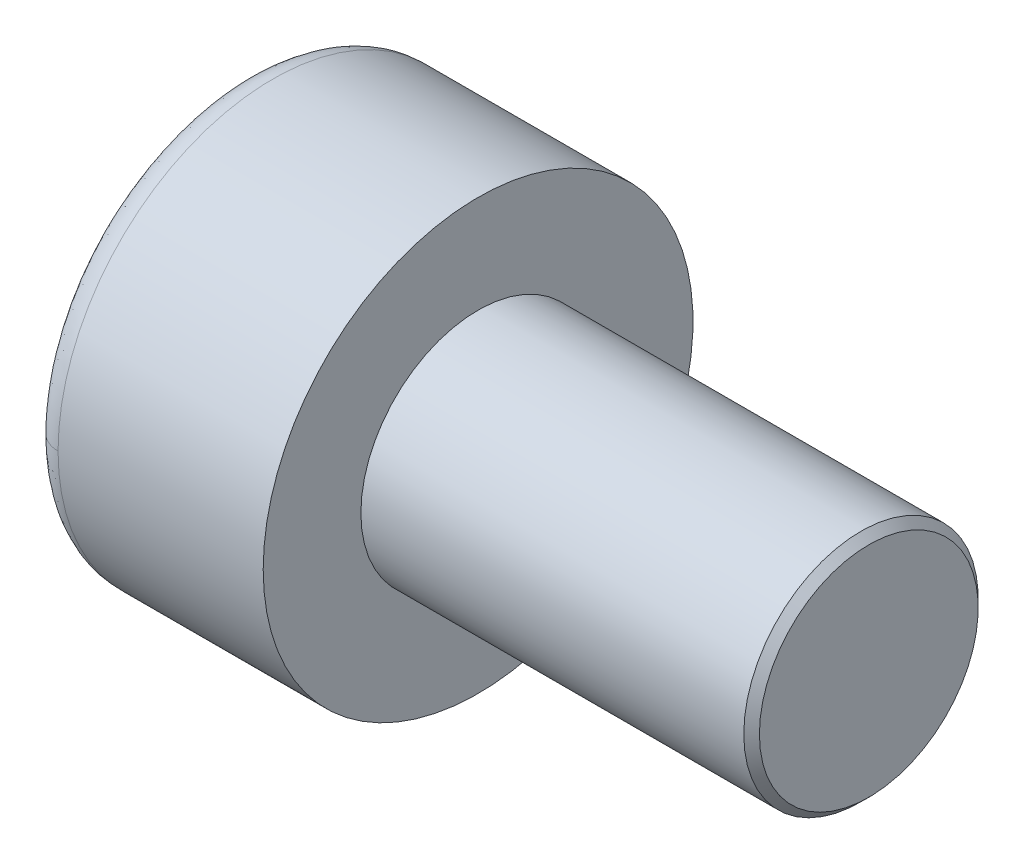
ISO-10303-21;
HEADER;
FILE_DESCRIPTION(('STEP AP214'),'2;1');
FILE_NAME('part.step','',(''),(''),'','','');
FILE_SCHEMA(('AUTOMOTIVE_DESIGN { 1 0 10303 214 1 1 1 1 }'));
ENDSEC;
DATA;
#1=APPLICATION_CONTEXT('core data for automotive mechanical design processes');
#2=APPLICATION_PROTOCOL_DEFINITION('international standard','automotive_design',2000,#1);
#3=PRODUCT_CONTEXT('',#1,'mechanical');
#4=PRODUCT('Part','Part','',(#3));
#5=PRODUCT_RELATED_PRODUCT_CATEGORY('part','',(#4));
#6=PRODUCT_DEFINITION_FORMATION('','',#4);
#7=PRODUCT_DEFINITION_CONTEXT('part definition',#1,'design');
#8=PRODUCT_DEFINITION('design','',#6,#7);
#9=PRODUCT_DEFINITION_SHAPE('','',#8);
#10=(LENGTH_UNIT() NAMED_UNIT(*) SI_UNIT(.MILLI.,.METRE.));
#11=(NAMED_UNIT(*) PLANE_ANGLE_UNIT() SI_UNIT($,.RADIAN.));
#12=(NAMED_UNIT(*) SI_UNIT($,.STERADIAN.) SOLID_ANGLE_UNIT());
#13=UNCERTAINTY_MEASURE_WITH_UNIT(LENGTH_MEASURE(1.E-05),#10,'distance_accuracy_value','');
#14=(GEOMETRIC_REPRESENTATION_CONTEXT(3) GLOBAL_UNCERTAINTY_ASSIGNED_CONTEXT((#13)) GLOBAL_UNIT_ASSIGNED_CONTEXT((#10,
#11,#12)) REPRESENTATION_CONTEXT('',''));
#15=CARTESIAN_POINT('',(0.,0.,0.));
#16=DIRECTION('',(0.,0.,1.));
#17=DIRECTION('',(1.,0.,0.));
#18=AXIS2_PLACEMENT_3D('',#15,#16,#17);
#19=CARTESIAN_POINT('',(3.,0.,0.));
#20=DIRECTION('',(1.,0.,0.));
#21=DIRECTION('',(0.,1.,0.));
#22=AXIS2_PLACEMENT_3D('',#19,#20,#21);
#23=PLANE('',#22);
#24=CARTESIAN_POINT('',(3.00000000001,0.,0.));
#25=DIRECTION('',(1.,0.,0.));
#26=DIRECTION('',(0.,0.,1.));
#27=AXIS2_PLACEMENT_3D('',#24,#25,#26);
#28=CIRCLE('',#27,1.5);
#29=CARTESIAN_POINT('',(3.00000000001,0.,1.5));
#30=VERTEX_POINT('',#29);
#31=EDGE_CURVE('E242',#30,#30,#28,.T.);
#32=ORIENTED_EDGE('',*,*,#31,.F.);
#33=EDGE_LOOP('',(#32));
#34=FACE_BOUND('',#33,.T.);
#35=CARTESIAN_POINT('',(3.00000000001,0.,0.));
#36=DIRECTION('',(1.,0.,0.));
#37=DIRECTION('',(0.,0.,1.));
#38=AXIS2_PLACEMENT_3D('',#35,#36,#37);
#39=CIRCLE('',#38,2.75);
#40=CARTESIAN_POINT('',(3.00000000001,0.,2.75));
#41=VERTEX_POINT('',#40);
#42=EDGE_CURVE('E9',#41,#41,#39,.T.);
#43=ORIENTED_EDGE('',*,*,#42,.T.);
#44=EDGE_LOOP('',(#43));
#45=FACE_BOUND('',#44,.T.);
#46=ADVANCED_FACE('F14',(#34,#45),#23,.T.);
#47=CARTESIAN_POINT('',(1.3,-2.5,0.));
#48=DIRECTION('',(-1.,0.,0.));
#49=DIRECTION('',(0.,0.,1.));
#50=AXIS2_PLACEMENT_3D('',#47,#48,#49);
#51=PLANE('',#50);
#52=DIRECTION('',(0.,0.866025403784437,0.5));
#53=VECTOR('',#52,1.);
#54=CARTESIAN_POINT('',(1.30000000002105,0.,-1.44337567298406));
#55=LINE('',#54,#53);
#56=CARTESIAN_POINT('',(1.30000000001289,0.625000000021032,-1.08253175476698));
#57=VERTEX_POINT('',#56);
#58=CARTESIAN_POINT('',(1.30000000000553,1.25000000000019,-0.721687836486922));
#59=VERTEX_POINT('',#58);
#60=EDGE_CURVE('E162',#57,#59,#55,.T.);
#61=ORIENTED_EDGE('',*,*,#60,.F.);
#62=CARTESIAN_POINT('',(1.30000000002473,0.,0.));
#63=DIRECTION('',(1.,0.,0.));
#64=DIRECTION('',(0.,0.,1.));
#65=AXIS2_PLACEMENT_3D('',#62,#63,#64);
#66=CIRCLE('',#65,1.25);
#67=CARTESIAN_POINT('',(1.30000000001289,1.25000000004206,0.));
#68=VERTEX_POINT('',#67);
#69=EDGE_CURVE('E190',#57,#68,#66,.T.);
#70=ORIENTED_EDGE('',*,*,#69,.T.);
#71=DIRECTION('',(0.,0.,1.));
#72=VECTOR('',#71,1.);
#73=CARTESIAN_POINT('',(1.30000000001368,1.25000000001,-0.721687836497031));
#74=LINE('',#73,#72);
#75=EDGE_CURVE('E243',#59,#68,#74,.T.);
#76=ORIENTED_EDGE('',*,*,#75,.F.);
#77=EDGE_LOOP('',(#61,#70,#76));
#78=FACE_BOUND('',#77,.T.);
#79=ADVANCED_FACE('F358',(#78),#51,.T.);
#80=CARTESIAN_POINT('',(1.3,-2.5,0.));
#81=DIRECTION('',(-1.,0.,0.));
#82=DIRECTION('',(0.,0.,1.));
#83=AXIS2_PLACEMENT_3D('',#80,#81,#82);
#84=PLANE('',#83);
#85=DIRECTION('',(0.,-0.866025403784436,-0.5));
#86=VECTOR('',#85,1.);
#87=CARTESIAN_POINT('',(1.30000000002105,0.,1.44337567298406));
#88=LINE('',#87,#86);
#89=CARTESIAN_POINT('',(1.30000000001289,-0.625000000021032,1.08253175476698));
#90=VERTEX_POINT('',#89);
#91=CARTESIAN_POINT('',(1.30000000000675,-1.25000000000028,0.721687836485308));
#92=VERTEX_POINT('',#91);
#93=EDGE_CURVE('E185',#90,#92,#88,.T.);
#94=ORIENTED_EDGE('',*,*,#93,.F.);
#95=CARTESIAN_POINT('',(1.30000000002473,0.,0.));
#96=DIRECTION('',(1.,0.,0.));
#97=DIRECTION('',(0.,0.,1.));
#98=AXIS2_PLACEMENT_3D('',#95,#96,#97);
#99=CIRCLE('',#98,1.25);
#100=CARTESIAN_POINT('',(1.30000000001289,-1.25000000004206,0.));
#101=VERTEX_POINT('',#100);
#102=EDGE_CURVE('E255',#90,#101,#99,.T.);
#103=ORIENTED_EDGE('',*,*,#102,.T.);
#104=DIRECTION('',(0.,0.,-1.));
#105=VECTOR('',#104,1.);
#106=CARTESIAN_POINT('',(1.30000000001368,-1.25000000001,0.721687836497032));
#107=LINE('',#106,#105);
#108=EDGE_CURVE('E183',#92,#101,#107,.T.);
#109=ORIENTED_EDGE('',*,*,#108,.F.);
#110=EDGE_LOOP('',(#94,#103,#109));
#111=FACE_BOUND('',#110,.T.);
#112=ADVANCED_FACE('F275',(#111),#84,.T.);
#113=CARTESIAN_POINT('',(1.3,-2.5,0.));
#114=DIRECTION('',(-1.,0.,0.));
#115=DIRECTION('',(0.,0.,1.));
#116=AXIS2_PLACEMENT_3D('',#113,#114,#115);
#117=PLANE('',#116);
#118=DIRECTION('',(0.,0.,-1.));
#119=VECTOR('',#118,1.);
#120=CARTESIAN_POINT('',(1.30000000002105,-1.25000000001,0.721687836497032));
#121=LINE('',#120,#119);
#122=CARTESIAN_POINT('',(1.30000000000675,-1.25,-0.721687836487034));
#123=VERTEX_POINT('',#122);
#124=EDGE_CURVE('E180',#101,#123,#121,.T.);
#125=ORIENTED_EDGE('',*,*,#124,.F.);
#126=CARTESIAN_POINT('',(1.30000000002473,0.,0.));
#127=DIRECTION('',(1.,0.,0.));
#128=DIRECTION('',(0.,0.,1.));
#129=AXIS2_PLACEMENT_3D('',#126,#127,#128);
#130=CIRCLE('',#129,1.25);
#131=CARTESIAN_POINT('',(1.30000000001289,-0.625000000021031,-1.08253175476698));
#132=VERTEX_POINT('',#131);
#133=EDGE_CURVE('E189',#101,#132,#130,.T.);
#134=ORIENTED_EDGE('',*,*,#133,.T.);
#135=DIRECTION('',(0.,0.866025403784437,-0.5));
#136=VECTOR('',#135,1.);
#137=CARTESIAN_POINT('',(1.30000000001368,-1.25000000001,-0.721687836497034));
#138=LINE('',#137,#136);
#139=EDGE_CURVE('E18',#123,#132,#138,.T.);
#140=ORIENTED_EDGE('',*,*,#139,.F.);
#141=EDGE_LOOP('',(#125,#134,#140));
#142=FACE_BOUND('',#141,.T.);
#143=ADVANCED_FACE('F343',(#142),#117,.T.);
#144=CARTESIAN_POINT('',(1.3,-2.5,0.));
#145=DIRECTION('',(-1.,0.,0.));
#146=DIRECTION('',(0.,0.,1.));
#147=AXIS2_PLACEMENT_3D('',#144,#145,#146);
#148=PLANE('',#147);
#149=DIRECTION('',(0.,-0.866025403784437,0.5));
#150=VECTOR('',#149,1.);
#151=CARTESIAN_POINT('',(1.30000000002105,1.25000000001,0.721687836497032));
#152=LINE('',#151,#150);
#153=CARTESIAN_POINT('',(1.30000000001289,0.625000000021031,1.08253175476698));
#154=VERTEX_POINT('',#153);
#155=CARTESIAN_POINT('',(1.30000000000675,0.,1.44337567297406));
#156=VERTEX_POINT('',#155);
#157=EDGE_CURVE('E216',#154,#156,#152,.T.);
#158=ORIENTED_EDGE('',*,*,#157,.F.);
#159=CARTESIAN_POINT('',(1.30000000002473,0.,0.));
#160=DIRECTION('',(1.,0.,0.));
#161=DIRECTION('',(0.,0.,1.));
#162=AXIS2_PLACEMENT_3D('',#159,#160,#161);
#163=CIRCLE('',#162,1.25);
#164=EDGE_CURVE('E230',#154,#90,#163,.T.);
#165=ORIENTED_EDGE('',*,*,#164,.T.);
#166=DIRECTION('',(0.,-0.866025403784436,-0.5));
#167=VECTOR('',#166,1.);
#168=CARTESIAN_POINT('',(1.30000000001368,0.,1.44337567298406));
#169=LINE('',#168,#167);
#170=EDGE_CURVE('E182',#156,#90,#169,.T.);
#171=ORIENTED_EDGE('',*,*,#170,.F.);
#172=EDGE_LOOP('',(#158,#165,#171));
#173=FACE_BOUND('',#172,.T.);
#174=ADVANCED_FACE('F340',(#173),#148,.T.);
#175=CARTESIAN_POINT('',(0.375,0.,2.75));
#176=CARTESIAN_POINT('',(0.375,-5.5,2.75));
#177=CARTESIAN_POINT('',(0.375,-5.5,-2.75));
#178=CARTESIAN_POINT('',(0.375,0.,-2.75));
#179=CARTESIAN_POINT('',(0.155330085889911,0.,2.75));
#180=CARTESIAN_POINT('',(0.155330085889911,-5.5,2.75));
#181=CARTESIAN_POINT('',(0.155330085889911,-5.5,-2.75));
#182=CARTESIAN_POINT('',(0.155330085889911,0.,-2.75));
#183=CARTESIAN_POINT('',(0.,0.,2.59466991411009));
#184=CARTESIAN_POINT('',(0.,-5.18933982822018,2.59466991411009));
#185=CARTESIAN_POINT('',(0.,-5.18933982822018,-2.59466991411009));
#186=CARTESIAN_POINT('',(0.,0.,-2.59466991411009));
#187=CARTESIAN_POINT('',(0.,0.,2.375));
#188=CARTESIAN_POINT('',(0.,-4.75,2.375));
#189=CARTESIAN_POINT('',(0.,-4.75,-2.375));
#190=CARTESIAN_POINT('',(0.,0.,-2.375));
#191=(BOUNDED_SURFACE() B_SPLINE_SURFACE(3,3,((#175,#176,#177,#178),(#179,#180,#181,#182),(#183,
#184,#185,#186),(#187,#188,#189,#190)),.UNSPECIFIED.,.F.,.F.,
.F.) B_SPLINE_SURFACE_WITH_KNOTS((4,4),(4,4),(0.,1.),(0.,1.),
.UNSPECIFIED.) GEOMETRIC_REPRESENTATION_ITEM() RATIONAL_B_SPLINE_SURFACE(((1.,0.333333333333333,
0.333333333333333,1.),(0.804737854124365,0.268245951374788,0.268245951374788,0.804737854124365),
(0.804737854124365,0.268245951374788,0.268245951374788,0.804737854124365),(1.,0.333333333333333,
0.333333333333333,1.))) REPRESENTATION_ITEM('') SURFACE());
#192=CARTESIAN_POINT('',(0.37500000001,0.,0.));
#193=DIRECTION('',(1.,0.,0.));
#194=DIRECTION('',(0.,0.,1.));
#195=AXIS2_PLACEMENT_3D('',#192,#193,#194);
#196=CIRCLE('',#195,2.75);
#197=CARTESIAN_POINT('',(0.375,0.,2.75));
#198=VERTEX_POINT('',#197);
#199=CARTESIAN_POINT('',(0.375,0.,-2.75));
#200=VERTEX_POINT('',#199);
#201=EDGE_CURVE('E25',#198,#200,#196,.T.);
#202=CARTESIAN_POINT('',(0.37500000001,0.,2.37500000001));
#203=DIRECTION('',(0.,-1.,0.));
#204=DIRECTION('',(0.,0.,1.));
#205=AXIS2_PLACEMENT_3D('',#202,#203,#204);
#206=CIRCLE('',#205,0.375);
#207=CARTESIAN_POINT('',(0.,0.,2.375));
#208=VERTEX_POINT('',#207);
#209=EDGE_CURVE('E151',#198,#208,#206,.T.);
#210=CARTESIAN_POINT('',(0.,0.,2.37500000001));
#211=CARTESIAN_POINT('',(0.,-4.75000000001,2.37500000001));
#212=CARTESIAN_POINT('',(0.,-4.75000000001,-2.37500000001));
#213=CARTESIAN_POINT('',(0.,0.,-2.37500000001));
#214=(BOUNDED_CURVE() B_SPLINE_CURVE(3,(#210,#211,#212,#213),.UNSPECIFIED.,.F.,
.F.) B_SPLINE_CURVE_WITH_KNOTS((4,4),(0.,1.),
.UNSPECIFIED.) CURVE() GEOMETRIC_REPRESENTATION_ITEM() RATIONAL_B_SPLINE_CURVE((1.,
0.333333333333333,0.333333333333333,1.)) REPRESENTATION_ITEM(''));
#215=CARTESIAN_POINT('',(0.,0.,-2.375));
#216=VERTEX_POINT('',#215);
#217=EDGE_CURVE('E199',#208,#216,#214,.T.);
#218=CARTESIAN_POINT('',(0.37500000001,0.,-2.37500000001));
#219=DIRECTION('',(0.,1.,0.));
#220=DIRECTION('',(0.,0.,-1.));
#221=AXIS2_PLACEMENT_3D('',#218,#219,#220);
#222=CIRCLE('',#221,0.375);
#223=EDGE_CURVE('E217',#200,#216,#222,.T.);
#224=ORIENTED_EDGE('',*,*,#201,.F.);
#225=ORIENTED_EDGE('',*,*,#209,.T.);
#226=ORIENTED_EDGE('',*,*,#217,.T.);
#227=ORIENTED_EDGE('',*,*,#223,.F.);
#228=EDGE_LOOP('',(#224,#225,#226,#227));
#229=FACE_BOUND('',#228,.T.);
#230=ADVANCED_FACE('F342',(#229),#191,.T.);
#231=CARTESIAN_POINT('',(3.,0.,0.));
#232=DIRECTION('',(-1.,0.,0.));
#233=DIRECTION('',(0.,0.,1.));
#234=AXIS2_PLACEMENT_3D('',#231,#232,#233);
#235=CYLINDRICAL_SURFACE('',#234,2.75);
#236=ORIENTED_EDGE('',*,*,#42,.F.);
#237=EDGE_LOOP('',(#236));
#238=FACE_BOUND('',#237,.T.);
#239=CARTESIAN_POINT('',(0.37500000001,0.,0.));
#240=DIRECTION('',(1.,0.,0.));
#241=DIRECTION('',(0.,0.,1.));
#242=AXIS2_PLACEMENT_3D('',#239,#240,#241);
#243=CIRCLE('',#242,2.75);
#244=EDGE_CURVE('E221',#200,#198,#243,.T.);
#245=ORIENTED_EDGE('',*,*,#244,.T.);
#246=ORIENTED_EDGE('',*,*,#201,.T.);
#247=EDGE_LOOP('',(#245,#246));
#248=FACE_BOUND('',#247,.T.);
#249=ADVANCED_FACE('F350',(#238,#248),#235,.T.);
#250=CARTESIAN_POINT('',(1.3,-2.5,0.));
#251=DIRECTION('',(-1.,0.,0.));
#252=DIRECTION('',(0.,0.,1.));
#253=AXIS2_PLACEMENT_3D('',#250,#251,#252);
#254=PLANE('',#253);
#255=DIRECTION('',(0.,0.866025403784437,-0.5));
#256=VECTOR('',#255,1.);
#257=CARTESIAN_POINT('',(1.30000000002105,-1.25000000001,-0.721687836497034));
#258=LINE('',#257,#256);
#259=CARTESIAN_POINT('',(1.30000000000634,0.,-1.44337567297406));
#260=VERTEX_POINT('',#259);
#261=EDGE_CURVE('E139',#132,#260,#258,.T.);
#262=ORIENTED_EDGE('',*,*,#261,.F.);
#263=CARTESIAN_POINT('',(1.30000000002473,0.,0.));
#264=DIRECTION('',(1.,0.,0.));
#265=DIRECTION('',(0.,0.,1.));
#266=AXIS2_PLACEMENT_3D('',#263,#264,#265);
#267=CIRCLE('',#266,1.25);
#268=EDGE_CURVE('E157',#132,#57,#267,.T.);
#269=ORIENTED_EDGE('',*,*,#268,.T.);
#270=DIRECTION('',(0.,0.866025403784437,0.5));
#271=VECTOR('',#270,1.);
#272=CARTESIAN_POINT('',(1.30000000001246,0.,-1.44337567298406));
#273=LINE('',#272,#271);
#274=EDGE_CURVE('E154',#260,#57,#273,.T.);
#275=ORIENTED_EDGE('',*,*,#274,.F.);
#276=EDGE_LOOP('',(#262,#269,#275));
#277=FACE_BOUND('',#276,.T.);
#278=ADVANCED_FACE('F155',(#277),#254,.T.);
#279=CARTESIAN_POINT('',(1.3,-2.5,0.));
#280=DIRECTION('',(-1.,0.,0.));
#281=DIRECTION('',(0.,0.,1.));
#282=AXIS2_PLACEMENT_3D('',#279,#280,#281);
#283=PLANE('',#282);
#284=DIRECTION('',(0.,0.,1.));
#285=VECTOR('',#284,1.);
#286=CARTESIAN_POINT('',(1.30000000002105,1.25000000001,-0.721687836497031));
#287=LINE('',#286,#285);
#288=CARTESIAN_POINT('',(1.30000000000675,1.25,0.721687836487032));
#289=VERTEX_POINT('',#288);
#290=EDGE_CURVE('E236',#68,#289,#287,.T.);
#291=ORIENTED_EDGE('',*,*,#290,.F.);
#292=CARTESIAN_POINT('',(1.30000000002473,0.,0.));
#293=DIRECTION('',(1.,0.,0.));
#294=DIRECTION('',(0.,0.,1.));
#295=AXIS2_PLACEMENT_3D('',#292,#293,#294);
#296=CIRCLE('',#295,1.25);
#297=EDGE_CURVE('E212',#68,#154,#296,.T.);
#298=ORIENTED_EDGE('',*,*,#297,.T.);
#299=DIRECTION('',(0.,-0.866025403784437,0.5));
#300=VECTOR('',#299,1.);
#301=CARTESIAN_POINT('',(1.30000000001368,1.25000000001,0.721687836497032));
#302=LINE('',#301,#300);
#303=EDGE_CURVE('E178',#289,#154,#302,.T.);
#304=ORIENTED_EDGE('',*,*,#303,.F.);
#305=EDGE_LOOP('',(#291,#298,#304));
#306=FACE_BOUND('',#305,.T.);
#307=ADVANCED_FACE('F334',(#306),#283,.T.);
#308=CARTESIAN_POINT('',(1.3,0.,1.44337567297406));
#309=DIRECTION('',(0.,0.5,-0.866025403784438));
#310=DIRECTION('',(-1.,0.,0.));
#311=AXIS2_PLACEMENT_3D('',#308,#309,#310);
#312=PLANE('',#311);
#313=DIRECTION('',(-1.,0.,0.));
#314=VECTOR('',#313,1.);
#315=CARTESIAN_POINT('',(1.30000000001,-1.25000000001057,0.721687836496703));
#316=LINE('',#315,#314);
#317=CARTESIAN_POINT('',(0.,-1.25000000000014,0.721687836486949));
#318=VERTEX_POINT('',#317);
#319=EDGE_CURVE('E220',#92,#318,#316,.T.);
#320=ORIENTED_EDGE('',*,*,#319,.T.);
#321=DIRECTION('',(0.,0.866025403784437,0.5));
#322=VECTOR('',#321,1.);
#323=CARTESIAN_POINT('',(0.,-1.25000000001,0.721687836497032));
#324=LINE('',#323,#322);
#325=CARTESIAN_POINT('',(0.,0.,1.44337567297406));
#326=VERTEX_POINT('',#325);
#327=EDGE_CURVE('E206',#318,#326,#324,.T.);
#328=ORIENTED_EDGE('',*,*,#327,.T.);
#329=DIRECTION('',(-1.,0.,0.));
#330=VECTOR('',#329,1.);
#331=CARTESIAN_POINT('',(1.30000000001,0.,1.44337567298406));
#332=LINE('',#331,#330);
#333=EDGE_CURVE('E196',#156,#326,#332,.T.);
#334=ORIENTED_EDGE('',*,*,#333,.F.);
#335=ORIENTED_EDGE('',*,*,#170,.T.);
#336=ORIENTED_EDGE('',*,*,#93,.T.);
#337=EDGE_LOOP('',(#320,#328,#334,#335,#336));
#338=FACE_BOUND('',#337,.T.);
#339=ADVANCED_FACE('F268',(#338),#312,.T.);
#340=CARTESIAN_POINT('',(1.3,-1.25,0.721687836487031));
#341=DIRECTION('',(0.,1.,0.));
#342=DIRECTION('',(1.,0.,0.));
#343=AXIS2_PLACEMENT_3D('',#340,#341,#342);
#344=PLANE('',#343);
#345=DIRECTION('',(-1.,0.,0.));
#346=VECTOR('',#345,1.);
#347=CARTESIAN_POINT('',(1.30000000001,-1.25000000001,-0.721687836497034));
#348=LINE('',#347,#346);
#349=CARTESIAN_POINT('',(0.,-1.25,-0.721687836487034));
#350=VERTEX_POINT('',#349);
#351=EDGE_CURVE('E259',#123,#350,#348,.T.);
#352=ORIENTED_EDGE('',*,*,#351,.T.);
#353=DIRECTION('',(0.,0.,1.));
#354=VECTOR('',#353,1.);
#355=CARTESIAN_POINT('',(0.,-1.25000000001,0.));
#356=LINE('',#355,#354);
#357=EDGE_CURVE('E253',#350,#318,#356,.T.);
#358=ORIENTED_EDGE('',*,*,#357,.T.);
#359=ORIENTED_EDGE('',*,*,#319,.F.);
#360=ORIENTED_EDGE('',*,*,#108,.T.);
#361=ORIENTED_EDGE('',*,*,#124,.T.);
#362=EDGE_LOOP('',(#352,#358,#359,#360,#361));
#363=FACE_BOUND('',#362,.T.);
#364=ADVANCED_FACE('F281',(#363),#344,.T.);
#365=CARTESIAN_POINT('',(7.89999999989277,0.,0.));
#366=DIRECTION('',(-1.,0.,0.));
#367=DIRECTION('',(0.,0.,1.));
#368=AXIS2_PLACEMENT_3D('',#365,#366,#367);
#369=CONICAL_SURFACE('',#368,1.5,0.7853981634);
#370=CARTESIAN_POINT('',(7.99999999999136,0.,0.));
#371=DIRECTION('',(-1.,0.,0.));
#372=DIRECTION('',(0.,0.,1.));
#373=AXIS2_PLACEMENT_3D('',#370,#371,#372);
#374=CIRCLE('',#373,1.4);
#375=CARTESIAN_POINT('',(7.99999999999136,0.,1.4));
#376=VERTEX_POINT('',#375);
#377=EDGE_CURVE('E225',#376,#376,#374,.T.);
#378=ORIENTED_EDGE('',*,*,#377,.T.);
#379=EDGE_LOOP('',(#378));
#380=FACE_BOUND('',#379,.T.);
#381=CARTESIAN_POINT('',(7.90000000001,0.,0.));
#382=DIRECTION('',(-1.,0.,0.));
#383=DIRECTION('',(0.,0.,1.));
#384=AXIS2_PLACEMENT_3D('',#381,#382,#383);
#385=CIRCLE('',#384,1.5);
#386=CARTESIAN_POINT('',(7.90000000001,0.,1.5));
#387=VERTEX_POINT('',#386);
#388=EDGE_CURVE('E302',#387,#387,#385,.T.);
#389=ORIENTED_EDGE('',*,*,#388,.F.);
#390=EDGE_LOOP('',(#389));
#391=FACE_BOUND('',#390,.T.);
#392=ADVANCED_FACE('F370',(#380,#391),#369,.T.);
#393=CARTESIAN_POINT('',(0.375,0.,-2.75));
#394=CARTESIAN_POINT('',(0.375,5.5,-2.75));
#395=CARTESIAN_POINT('',(0.375,5.5,2.75));
#396=CARTESIAN_POINT('',(0.375,0.,2.75));
#397=CARTESIAN_POINT('',(0.155330085889911,0.,-2.75));
#398=CARTESIAN_POINT('',(0.155330085889911,5.5,-2.75));
#399=CARTESIAN_POINT('',(0.155330085889911,5.5,2.75));
#400=CARTESIAN_POINT('',(0.155330085889911,0.,2.75));
#401=CARTESIAN_POINT('',(0.,0.,-2.59466991411009));
#402=CARTESIAN_POINT('',(0.,5.18933982822018,-2.59466991411009));
#403=CARTESIAN_POINT('',(0.,5.18933982822018,2.59466991411009));
#404=CARTESIAN_POINT('',(0.,0.,2.59466991411009));
#405=CARTESIAN_POINT('',(0.,0.,-2.375));
#406=CARTESIAN_POINT('',(0.,4.75,-2.375));
#407=CARTESIAN_POINT('',(0.,4.75,2.375));
#408=CARTESIAN_POINT('',(0.,0.,2.375));
#409=(BOUNDED_SURFACE() B_SPLINE_SURFACE(3,3,((#393,#394,#395,#396),(#397,#398,#399,#400),(#401,
#402,#403,#404),(#405,#406,#407,#408)),.UNSPECIFIED.,.F.,.F.,
.F.) B_SPLINE_SURFACE_WITH_KNOTS((4,4),(4,4),(0.,1.),(0.,1.),
.UNSPECIFIED.) GEOMETRIC_REPRESENTATION_ITEM() RATIONAL_B_SPLINE_SURFACE(((1.,0.333333333333333,
0.333333333333333,1.),(0.804737854124365,0.268245951374788,0.268245951374788,0.804737854124365),
(0.804737854124365,0.268245951374788,0.268245951374788,0.804737854124365),(1.,0.333333333333333,
0.333333333333333,1.))) REPRESENTATION_ITEM('') SURFACE());
#410=CARTESIAN_POINT('',(0.,0.,-2.37500000001));
#411=CARTESIAN_POINT('',(0.,4.75000000001,-2.37500000001));
#412=CARTESIAN_POINT('',(0.,4.75000000001,2.37500000001));
#413=CARTESIAN_POINT('',(0.,0.,2.37500000001));
#414=(BOUNDED_CURVE() B_SPLINE_CURVE(3,(#410,#411,#412,#413),.UNSPECIFIED.,.F.,
.F.) B_SPLINE_CURVE_WITH_KNOTS((4,4),(0.,1.),
.UNSPECIFIED.) CURVE() GEOMETRIC_REPRESENTATION_ITEM() RATIONAL_B_SPLINE_CURVE((1.,
0.333333333333333,0.333333333333333,1.)) REPRESENTATION_ITEM(''));
#415=EDGE_CURVE('E200',#216,#208,#414,.T.);
#416=ORIENTED_EDGE('',*,*,#209,.F.);
#417=ORIENTED_EDGE('',*,*,#244,.F.);
#418=ORIENTED_EDGE('',*,*,#223,.T.);
#419=ORIENTED_EDGE('',*,*,#415,.T.);
#420=EDGE_LOOP('',(#416,#417,#418,#419));
#421=FACE_BOUND('',#420,.T.);
#422=ADVANCED_FACE('F373',(#421),#409,.T.);
#423=CARTESIAN_POINT('',(1.3,-1.25,-0.721687836487034));
#424=DIRECTION('',(0.,0.5,0.866025403784439));
#425=DIRECTION('',(1.,0.,0.));
#426=AXIS2_PLACEMENT_3D('',#423,#424,#425);
#427=PLANE('',#426);
#428=DIRECTION('',(-1.,0.,0.));
#429=VECTOR('',#428,1.);
#430=CARTESIAN_POINT('',(1.30000000001,0.,-1.44337567298406));
#431=LINE('',#430,#429);
#432=CARTESIAN_POINT('',(0.,0.,-1.44337567297406));
#433=VERTEX_POINT('',#432);
#434=EDGE_CURVE('E144',#260,#433,#431,.T.);
#435=ORIENTED_EDGE('',*,*,#434,.T.);
#436=DIRECTION('',(0.,-0.866025403784437,0.5));
#437=VECTOR('',#436,1.);
#438=CARTESIAN_POINT('',(0.,0.,-1.44337567298406));
#439=LINE('',#438,#437);
#440=EDGE_CURVE('E250',#433,#350,#439,.T.);
#441=ORIENTED_EDGE('',*,*,#440,.T.);
#442=ORIENTED_EDGE('',*,*,#351,.F.);
#443=ORIENTED_EDGE('',*,*,#139,.T.);
#444=ORIENTED_EDGE('',*,*,#261,.T.);
#445=EDGE_LOOP('',(#435,#441,#442,#443,#444));
#446=FACE_BOUND('',#445,.T.);
#447=ADVANCED_FACE('F141',(#446),#427,.T.);
#448=CARTESIAN_POINT('',(1.30000000001473,0.,0.));
#449=DIRECTION('',(-1.,0.,0.));
#450=DIRECTION('',(0.,0.,1.));
#451=AXIS2_PLACEMENT_3D('',#448,#449,#450);
#452=CONICAL_SURFACE('',#451,1.25,1.0471975511);
#453=CARTESIAN_POINT('',(2.02168783667389,0.,0.));
#454=VERTEX_POINT('',#453);
#455=VERTEX_LOOP('',#454);
#456=FACE_BOUND('',#455,.T.);
#457=ORIENTED_EDGE('',*,*,#164,.F.);
#458=ORIENTED_EDGE('',*,*,#297,.F.);
#459=ORIENTED_EDGE('',*,*,#69,.F.);
#460=ORIENTED_EDGE('',*,*,#268,.F.);
#461=ORIENTED_EDGE('',*,*,#133,.F.);
#462=ORIENTED_EDGE('',*,*,#102,.F.);
#463=EDGE_LOOP('',(#457,#458,#459,#460,#461,#462));
#464=FACE_BOUND('',#463,.T.);
#465=ADVANCED_FACE('F338',(#456,#464),#452,.F.);
#466=CARTESIAN_POINT('',(8.,0.,0.));
#467=DIRECTION('',(-1.,0.,0.));
#468=DIRECTION('',(0.,0.,1.));
#469=AXIS2_PLACEMENT_3D('',#466,#467,#468);
#470=CYLINDRICAL_SURFACE('',#469,1.5);
#471=ORIENTED_EDGE('',*,*,#388,.T.);
#472=EDGE_LOOP('',(#471));
#473=FACE_BOUND('',#472,.T.);
#474=ORIENTED_EDGE('',*,*,#31,.T.);
#475=EDGE_LOOP('',(#474));
#476=FACE_BOUND('',#475,.T.);
#477=ADVANCED_FACE('F403',(#473,#476),#470,.T.);
#478=CARTESIAN_POINT('',(1.3,1.25,-0.721687836487031));
#479=DIRECTION('',(0.,-1.,0.));
#480=DIRECTION('',(0.,0.,-1.));
#481=AXIS2_PLACEMENT_3D('',#478,#479,#480);
#482=PLANE('',#481);
#483=DIRECTION('',(-1.,0.,0.));
#484=VECTOR('',#483,1.);
#485=CARTESIAN_POINT('',(1.30000000001,1.25000000001,0.721687836497032));
#486=LINE('',#485,#484);
#487=CARTESIAN_POINT('',(0.,1.25,0.721687836487032));
#488=VERTEX_POINT('',#487);
#489=EDGE_CURVE('E195',#289,#488,#486,.T.);
#490=ORIENTED_EDGE('',*,*,#489,.T.);
#491=DIRECTION('',(0.,0.,-1.));
#492=VECTOR('',#491,1.);
#493=CARTESIAN_POINT('',(0.,1.25000000001,0.));
#494=LINE('',#493,#492);
#495=CARTESIAN_POINT('',(0.,1.25,-0.721687836487031));
#496=VERTEX_POINT('',#495);
#497=EDGE_CURVE('E252',#488,#496,#494,.T.);
#498=ORIENTED_EDGE('',*,*,#497,.T.);
#499=DIRECTION('',(1.,0.,0.));
#500=VECTOR('',#499,1.);
#501=CARTESIAN_POINT('',(1.30000000001,1.25000000001,-0.721687836497031));
#502=LINE('',#501,#500);
#503=EDGE_CURVE('E175',#496,#59,#502,.T.);
#504=ORIENTED_EDGE('',*,*,#503,.T.);
#505=ORIENTED_EDGE('',*,*,#75,.T.);
#506=ORIENTED_EDGE('',*,*,#290,.T.);
#507=EDGE_LOOP('',(#490,#498,#504,#505,#506));
#508=FACE_BOUND('',#507,.T.);
#509=ADVANCED_FACE('F400',(#508),#482,.T.);
#510=CARTESIAN_POINT('',(0.,0.,0.));
#511=DIRECTION('',(1.,0.,0.));
#512=DIRECTION('',(0.,1.,0.));
#513=AXIS2_PLACEMENT_3D('',#510,#511,#512);
#514=PLANE('',#513);
#515=DIRECTION('',(0.,0.866025403784437,-0.5));
#516=VECTOR('',#515,1.);
#517=CARTESIAN_POINT('',(0.,0.,1.44337567298406));
#518=LINE('',#517,#516);
#519=EDGE_CURVE('E191',#326,#488,#518,.T.);
#520=ORIENTED_EDGE('',*,*,#519,.F.);
#521=ORIENTED_EDGE('',*,*,#327,.F.);
#522=ORIENTED_EDGE('',*,*,#357,.F.);
#523=ORIENTED_EDGE('',*,*,#440,.F.);
#524=DIRECTION('',(0.,-0.866025403784437,-0.5));
#525=VECTOR('',#524,1.);
#526=CARTESIAN_POINT('',(0.,1.25000000001,-0.721687836497031));
#527=LINE('',#526,#525);
#528=EDGE_CURVE('E167',#496,#433,#527,.T.);
#529=ORIENTED_EDGE('',*,*,#528,.F.);
#530=ORIENTED_EDGE('',*,*,#497,.F.);
#531=EDGE_LOOP('',(#520,#521,#522,#523,#529,#530));
#532=FACE_BOUND('',#531,.T.);
#533=ORIENTED_EDGE('',*,*,#217,.F.);
#534=ORIENTED_EDGE('',*,*,#415,.F.);
#535=EDGE_LOOP('',(#533,#534));
#536=FACE_BOUND('',#535,.T.);
#537=ADVANCED_FACE('F402',(#532,#536),#514,.F.);
#538=CARTESIAN_POINT('',(1.3,0.,-1.44337567297406));
#539=DIRECTION('',(0.,-0.5,0.866025403784439));
#540=DIRECTION('',(-1.,0.,0.));
#541=AXIS2_PLACEMENT_3D('',#538,#539,#540);
#542=PLANE('',#541);
#543=ORIENTED_EDGE('',*,*,#503,.F.);
#544=ORIENTED_EDGE('',*,*,#528,.T.);
#545=ORIENTED_EDGE('',*,*,#434,.F.);
#546=ORIENTED_EDGE('',*,*,#274,.T.);
#547=ORIENTED_EDGE('',*,*,#60,.T.);
#548=EDGE_LOOP('',(#543,#544,#545,#546,#547));
#549=FACE_BOUND('',#548,.T.);
#550=ADVANCED_FACE('F165',(#549),#542,.T.);
#551=CARTESIAN_POINT('',(1.3,1.25,0.721687836487032));
#552=DIRECTION('',(0.,-0.5,-0.866025403784439));
#553=DIRECTION('',(0.,-0.866025403784439,0.5));
#554=AXIS2_PLACEMENT_3D('',#551,#552,#553);
#555=PLANE('',#554);
#556=ORIENTED_EDGE('',*,*,#333,.T.);
#557=ORIENTED_EDGE('',*,*,#519,.T.);
#558=ORIENTED_EDGE('',*,*,#489,.F.);
#559=ORIENTED_EDGE('',*,*,#303,.T.);
#560=ORIENTED_EDGE('',*,*,#157,.T.);
#561=EDGE_LOOP('',(#556,#557,#558,#559,#560));
#562=FACE_BOUND('',#561,.T.);
#563=ADVANCED_FACE('F330',(#562),#555,.T.);
#564=CARTESIAN_POINT('',(8.,0.,0.));
#565=DIRECTION('',(1.,0.,0.));
#566=DIRECTION('',(0.,1.,0.));
#567=AXIS2_PLACEMENT_3D('',#564,#565,#566);
#568=PLANE('',#567);
#569=ORIENTED_EDGE('',*,*,#377,.F.);
#570=EDGE_LOOP('',(#569));
#571=FACE_BOUND('',#570,.T.);
#572=ADVANCED_FACE('F16',(#571),#568,.T.);
#573=CLOSED_SHELL('',(#46,#79,#112,#143,#174,#230,#249,#278,#307,#339,#364,#392,#422,#447,#465,
#477,#509,#537,#550,#563,#572));
#574=MANIFOLD_SOLID_BREP('B1',#573);
#575=ADVANCED_BREP_SHAPE_REPRESENTATION('',(#18,#574),#14);
#576=SHAPE_DEFINITION_REPRESENTATION(#9,#575);
ENDSEC;
END-ISO-10303-21;
